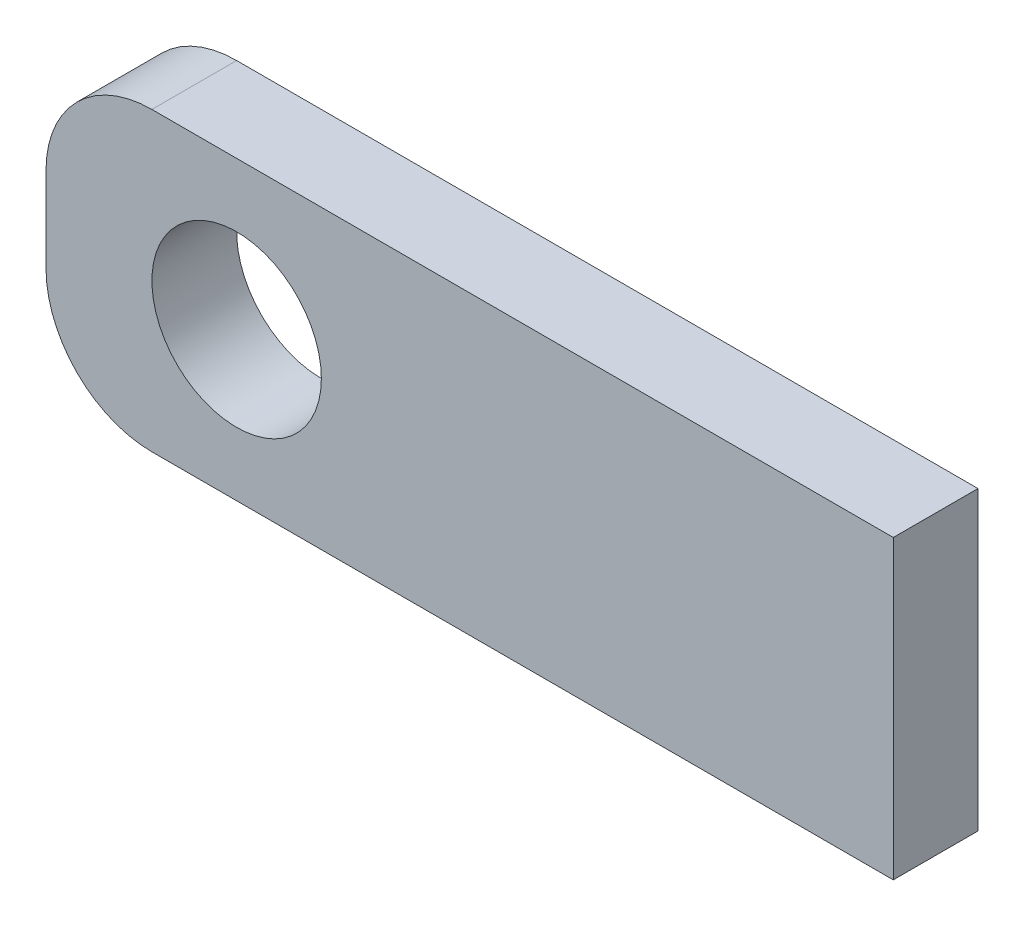
ISO-10303-21;
HEADER;
FILE_DESCRIPTION(('STEP AP214'),'2;1');
FILE_NAME('part.step','',(''),(''),'','','');
FILE_SCHEMA(('AUTOMOTIVE_DESIGN { 1 0 10303 214 1 1 1 1 }'));
ENDSEC;
DATA;
#1=APPLICATION_CONTEXT('core data for automotive mechanical design processes');
#2=APPLICATION_PROTOCOL_DEFINITION('international standard','automotive_design',2000,#1);
#3=PRODUCT_CONTEXT('',#1,'mechanical');
#4=PRODUCT('Part','Part','',(#3));
#5=PRODUCT_RELATED_PRODUCT_CATEGORY('part','',(#4));
#6=PRODUCT_DEFINITION_FORMATION('','',#4);
#7=PRODUCT_DEFINITION_CONTEXT('part definition',#1,'design');
#8=PRODUCT_DEFINITION('design','',#6,#7);
#9=PRODUCT_DEFINITION_SHAPE('','',#8);
#10=(LENGTH_UNIT() NAMED_UNIT(*) SI_UNIT(.MILLI.,.METRE.));
#11=(NAMED_UNIT(*) PLANE_ANGLE_UNIT() SI_UNIT($,.RADIAN.));
#12=(NAMED_UNIT(*) SI_UNIT($,.STERADIAN.) SOLID_ANGLE_UNIT());
#13=UNCERTAINTY_MEASURE_WITH_UNIT(LENGTH_MEASURE(1.E-05),#10,'distance_accuracy_value','');
#14=(GEOMETRIC_REPRESENTATION_CONTEXT(3) GLOBAL_UNCERTAINTY_ASSIGNED_CONTEXT((#13)) GLOBAL_UNIT_ASSIGNED_CONTEXT((#10,
#11,#12)) REPRESENTATION_CONTEXT('',''));
#15=CARTESIAN_POINT('',(0.,0.,0.));
#16=DIRECTION('',(0.,0.,1.));
#17=DIRECTION('',(1.,0.,0.));
#18=AXIS2_PLACEMENT_3D('',#15,#16,#17);
#19=CARTESIAN_POINT('',(0.,0.,4.));
#20=DIRECTION('',(0.,0.,1.));
#21=DIRECTION('',(1.,0.,0.));
#22=AXIS2_PLACEMENT_3D('',#19,#20,#21);
#23=PLANE('',#22);
#24=DIRECTION('',(0.,-1.,0.));
#25=VECTOR('',#24,1.);
#26=CARTESIAN_POINT('',(-40.,0.,4.));
#27=LINE('',#26,#25);
#28=CARTESIAN_POINT('',(-40.,8.99999999999999,4.));
#29=VERTEX_POINT('',#28);
#30=CARTESIAN_POINT('',(-40.,5.,4.));
#31=VERTEX_POINT('',#30);
#32=EDGE_CURVE('E93',#29,#31,#27,.T.);
#33=ORIENTED_EDGE('',*,*,#32,.T.);
#34=CARTESIAN_POINT('',(-35.,5.,4.));
#35=DIRECTION('',(0.,0.,1.));
#36=DIRECTION('',(1.,0.,0.));
#37=AXIS2_PLACEMENT_3D('',#34,#35,#36);
#38=CIRCLE('',#37,5.);
#39=CARTESIAN_POINT('',(-35.,0.,4.));
#40=VERTEX_POINT('',#39);
#41=EDGE_CURVE('E41',#31,#40,#38,.T.);
#42=ORIENTED_EDGE('',*,*,#41,.T.);
#43=DIRECTION('',(1.,0.,0.));
#44=VECTOR('',#43,1.);
#45=CARTESIAN_POINT('',(0.,0.,4.));
#46=LINE('',#45,#44);
#47=CARTESIAN_POINT('',(0.,0.,4.));
#48=VERTEX_POINT('',#47);
#49=EDGE_CURVE('E99',#40,#48,#46,.T.);
#50=ORIENTED_EDGE('',*,*,#49,.T.);
#51=DIRECTION('',(0.,1.,0.));
#52=VECTOR('',#51,1.);
#53=CARTESIAN_POINT('',(0.,0.,4.));
#54=LINE('',#53,#52);
#55=CARTESIAN_POINT('',(0.,14.,4.));
#56=VERTEX_POINT('',#55);
#57=EDGE_CURVE('E94',#48,#56,#54,.T.);
#58=ORIENTED_EDGE('',*,*,#57,.T.);
#59=DIRECTION('',(-1.,0.,0.));
#60=VECTOR('',#59,1.);
#61=CARTESIAN_POINT('',(0.,14.,4.));
#62=LINE('',#61,#60);
#63=CARTESIAN_POINT('',(-35.,14.,4.));
#64=VERTEX_POINT('',#63);
#65=EDGE_CURVE('E85',#56,#64,#62,.T.);
#66=ORIENTED_EDGE('',*,*,#65,.T.);
#67=CARTESIAN_POINT('',(-35.,8.99999999999999,4.));
#68=DIRECTION('',(0.,0.,1.));
#69=DIRECTION('',(1.,0.,0.));
#70=AXIS2_PLACEMENT_3D('',#67,#68,#69);
#71=CIRCLE('',#70,5.);
#72=EDGE_CURVE('E124',#64,#29,#71,.T.);
#73=ORIENTED_EDGE('',*,*,#72,.T.);
#74=EDGE_LOOP('',(#33,#42,#50,#58,#66,#73));
#75=FACE_BOUND('',#74,.T.);
#76=CARTESIAN_POINT('',(-31.,7.,4.));
#77=DIRECTION('',(0.,0.,1.));
#78=DIRECTION('',(1.,0.,0.));
#79=AXIS2_PLACEMENT_3D('',#76,#77,#78);
#80=CIRCLE('',#79,4.);
#81=CARTESIAN_POINT('',(-27.,7.,4.));
#82=VERTEX_POINT('',#81);
#83=EDGE_CURVE('E144',#82,#82,#80,.T.);
#84=ORIENTED_EDGE('',*,*,#83,.F.);
#85=EDGE_LOOP('',(#84));
#86=FACE_BOUND('',#85,.T.);
#87=ADVANCED_FACE('F33',(#75,#86),#23,.T.);
#88=CARTESIAN_POINT('',(0.,0.,0.));
#89=DIRECTION('',(0.,0.,1.));
#90=DIRECTION('',(1.,0.,0.));
#91=AXIS2_PLACEMENT_3D('',#88,#89,#90);
#92=PLANE('',#91);
#93=DIRECTION('',(1.,0.,0.));
#94=VECTOR('',#93,1.);
#95=CARTESIAN_POINT('',(0.,0.,0.));
#96=LINE('',#95,#94);
#97=CARTESIAN_POINT('',(-35.,0.,0.));
#98=VERTEX_POINT('',#97);
#99=CARTESIAN_POINT('',(0.,0.,0.));
#100=VERTEX_POINT('',#99);
#101=EDGE_CURVE('E103',#98,#100,#96,.T.);
#102=ORIENTED_EDGE('',*,*,#101,.F.);
#103=CARTESIAN_POINT('',(-35.,5.,0.));
#104=DIRECTION('',(0.,0.,1.));
#105=DIRECTION('',(1.,0.,0.));
#106=AXIS2_PLACEMENT_3D('',#103,#104,#105);
#107=CIRCLE('',#106,5.);
#108=CARTESIAN_POINT('',(-40.,5.,0.));
#109=VERTEX_POINT('',#108);
#110=EDGE_CURVE('E118',#98,#109,#107,.F.);
#111=ORIENTED_EDGE('',*,*,#110,.T.);
#112=DIRECTION('',(0.,-1.,0.));
#113=VECTOR('',#112,1.);
#114=CARTESIAN_POINT('',(-40.,0.,0.));
#115=LINE('',#114,#113);
#116=CARTESIAN_POINT('',(-40.,8.99999999999999,0.));
#117=VERTEX_POINT('',#116);
#118=EDGE_CURVE('E137',#117,#109,#115,.T.);
#119=ORIENTED_EDGE('',*,*,#118,.F.);
#120=CARTESIAN_POINT('',(-35.,8.99999999999999,0.));
#121=DIRECTION('',(0.,0.,1.));
#122=DIRECTION('',(1.,0.,0.));
#123=AXIS2_PLACEMENT_3D('',#120,#121,#122);
#124=CIRCLE('',#123,5.);
#125=CARTESIAN_POINT('',(-35.,14.,0.));
#126=VERTEX_POINT('',#125);
#127=EDGE_CURVE('E112',#117,#126,#124,.F.);
#128=ORIENTED_EDGE('',*,*,#127,.T.);
#129=DIRECTION('',(-1.,0.,0.));
#130=VECTOR('',#129,1.);
#131=CARTESIAN_POINT('',(0.,14.,0.));
#132=LINE('',#131,#130);
#133=CARTESIAN_POINT('',(0.,14.,0.));
#134=VERTEX_POINT('',#133);
#135=EDGE_CURVE('E140',#134,#126,#132,.T.);
#136=ORIENTED_EDGE('',*,*,#135,.F.);
#137=DIRECTION('',(0.,1.,0.));
#138=VECTOR('',#137,1.);
#139=CARTESIAN_POINT('',(0.,0.,0.));
#140=LINE('',#139,#138);
#141=EDGE_CURVE('E107',#100,#134,#140,.T.);
#142=ORIENTED_EDGE('',*,*,#141,.F.);
#143=EDGE_LOOP('',(#102,#111,#119,#128,#136,#142));
#144=FACE_BOUND('',#143,.T.);
#145=CARTESIAN_POINT('',(-31.,7.,0.));
#146=DIRECTION('',(0.,0.,1.));
#147=DIRECTION('',(1.,0.,0.));
#148=AXIS2_PLACEMENT_3D('',#145,#146,#147);
#149=CIRCLE('',#148,4.);
#150=CARTESIAN_POINT('',(-27.,7.,0.));
#151=VERTEX_POINT('',#150);
#152=EDGE_CURVE('E147',#151,#151,#149,.T.);
#153=ORIENTED_EDGE('',*,*,#152,.T.);
#154=EDGE_LOOP('',(#153));
#155=FACE_BOUND('',#154,.T.);
#156=ADVANCED_FACE('F135',(#144,#155),#92,.F.);
#157=CARTESIAN_POINT('',(0.,0.,4.));
#158=DIRECTION('',(-1.,0.,0.));
#159=DIRECTION('',(0.,0.,1.));
#160=AXIS2_PLACEMENT_3D('',#157,#158,#159);
#161=PLANE('',#160);
#162=ORIENTED_EDGE('',*,*,#141,.T.);
#163=DIRECTION('',(0.,0.,-1.));
#164=VECTOR('',#163,1.);
#165=CARTESIAN_POINT('',(0.,14.,4.));
#166=LINE('',#165,#164);
#167=EDGE_CURVE('E89',#56,#134,#166,.T.);
#168=ORIENTED_EDGE('',*,*,#167,.F.);
#169=ORIENTED_EDGE('',*,*,#57,.F.);
#170=DIRECTION('',(0.,0.,-1.));
#171=VECTOR('',#170,1.);
#172=CARTESIAN_POINT('',(0.,0.,4.));
#173=LINE('',#172,#171);
#174=EDGE_CURVE('E109',#48,#100,#173,.T.);
#175=ORIENTED_EDGE('',*,*,#174,.T.);
#176=EDGE_LOOP('',(#162,#168,#169,#175));
#177=FACE_BOUND('',#176,.T.);
#178=ADVANCED_FACE('F105',(#177),#161,.F.);
#179=CARTESIAN_POINT('',(0.,14.,4.));
#180=DIRECTION('',(0.,-1.,0.));
#181=DIRECTION('',(1.,0.,0.));
#182=AXIS2_PLACEMENT_3D('',#179,#180,#181);
#183=PLANE('',#182);
#184=ORIENTED_EDGE('',*,*,#135,.T.);
#185=DIRECTION('',(0.,0.,-1.));
#186=VECTOR('',#185,1.);
#187=CARTESIAN_POINT('',(-35.,14.,4.));
#188=LINE('',#187,#186);
#189=EDGE_CURVE('E11',#126,#64,#188,.F.);
#190=ORIENTED_EDGE('',*,*,#189,.T.);
#191=ORIENTED_EDGE('',*,*,#65,.F.);
#192=ORIENTED_EDGE('',*,*,#167,.T.);
#193=EDGE_LOOP('',(#184,#190,#191,#192));
#194=FACE_BOUND('',#193,.T.);
#195=ADVANCED_FACE('F87',(#194),#183,.F.);
#196=CARTESIAN_POINT('',(-40.,0.,4.));
#197=DIRECTION('',(1.,0.,0.));
#198=DIRECTION('',(0.,0.,-1.));
#199=AXIS2_PLACEMENT_3D('',#196,#197,#198);
#200=PLANE('',#199);
#201=ORIENTED_EDGE('',*,*,#118,.T.);
#202=DIRECTION('',(0.,0.,-1.));
#203=VECTOR('',#202,1.);
#204=CARTESIAN_POINT('',(-40.,5.,4.));
#205=LINE('',#204,#203);
#206=EDGE_CURVE('E54',#109,#31,#205,.F.);
#207=ORIENTED_EDGE('',*,*,#206,.T.);
#208=ORIENTED_EDGE('',*,*,#32,.F.);
#209=DIRECTION('',(0.,0.,-1.));
#210=VECTOR('',#209,1.);
#211=CARTESIAN_POINT('',(-40.,8.99999999999999,4.));
#212=LINE('',#211,#210);
#213=EDGE_CURVE('E120',#29,#117,#212,.T.);
#214=ORIENTED_EDGE('',*,*,#213,.T.);
#215=EDGE_LOOP('',(#201,#207,#208,#214));
#216=FACE_BOUND('',#215,.T.);
#217=ADVANCED_FACE('F138',(#216),#200,.F.);
#218=CARTESIAN_POINT('',(0.,0.,4.));
#219=DIRECTION('',(0.,1.,0.));
#220=DIRECTION('',(0.,0.,1.));
#221=AXIS2_PLACEMENT_3D('',#218,#219,#220);
#222=PLANE('',#221);
#223=ORIENTED_EDGE('',*,*,#49,.F.);
#224=DIRECTION('',(0.,0.,-1.));
#225=VECTOR('',#224,1.);
#226=CARTESIAN_POINT('',(-35.,0.,4.));
#227=LINE('',#226,#225);
#228=EDGE_CURVE('E108',#40,#98,#227,.T.);
#229=ORIENTED_EDGE('',*,*,#228,.T.);
#230=ORIENTED_EDGE('',*,*,#101,.T.);
#231=ORIENTED_EDGE('',*,*,#174,.F.);
#232=EDGE_LOOP('',(#223,#229,#230,#231));
#233=FACE_BOUND('',#232,.T.);
#234=ADVANCED_FACE('F129',(#233),#222,.F.);
#235=CARTESIAN_POINT('',(-31.,7.,4.));
#236=DIRECTION('',(0.,0.,-1.));
#237=DIRECTION('',(-1.,0.,0.));
#238=AXIS2_PLACEMENT_3D('',#235,#236,#237);
#239=CYLINDRICAL_SURFACE('',#238,4.);
#240=ORIENTED_EDGE('',*,*,#83,.T.);
#241=EDGE_LOOP('',(#240));
#242=FACE_BOUND('',#241,.T.);
#243=ORIENTED_EDGE('',*,*,#152,.F.);
#244=EDGE_LOOP('',(#243));
#245=FACE_BOUND('',#244,.T.);
#246=ADVANCED_FACE('F153',(#242,#245),#239,.F.);
#247=CARTESIAN_POINT('',(-35.,5.,4.));
#248=DIRECTION('',(0.,0.,-1.));
#249=DIRECTION('',(-1.,0.,0.));
#250=AXIS2_PLACEMENT_3D('',#247,#248,#249);
#251=CYLINDRICAL_SURFACE('',#250,5.);
#252=ORIENTED_EDGE('',*,*,#41,.F.);
#253=ORIENTED_EDGE('',*,*,#206,.F.);
#254=ORIENTED_EDGE('',*,*,#110,.F.);
#255=ORIENTED_EDGE('',*,*,#228,.F.);
#256=EDGE_LOOP('',(#252,#253,#254,#255));
#257=FACE_BOUND('',#256,.T.);
#258=ADVANCED_FACE('F132',(#257),#251,.T.);
#259=CARTESIAN_POINT('',(-35.,8.99999999999999,4.));
#260=DIRECTION('',(0.,0.,-1.));
#261=DIRECTION('',(-1.,0.,0.));
#262=AXIS2_PLACEMENT_3D('',#259,#260,#261);
#263=CYLINDRICAL_SURFACE('',#262,5.);
#264=ORIENTED_EDGE('',*,*,#72,.F.);
#265=ORIENTED_EDGE('',*,*,#189,.F.);
#266=ORIENTED_EDGE('',*,*,#127,.F.);
#267=ORIENTED_EDGE('',*,*,#213,.F.);
#268=EDGE_LOOP('',(#264,#265,#266,#267));
#269=FACE_BOUND('',#268,.T.);
#270=ADVANCED_FACE('F35',(#269),#263,.T.);
#271=CLOSED_SHELL('',(#87,#156,#178,#195,#217,#234,#246,#258,#270));
#272=MANIFOLD_SOLID_BREP('B2',#271);
#273=ADVANCED_BREP_SHAPE_REPRESENTATION('',(#18,#272),#14);
#274=SHAPE_DEFINITION_REPRESENTATION(#9,#273);
ENDSEC;
END-ISO-10303-21;
